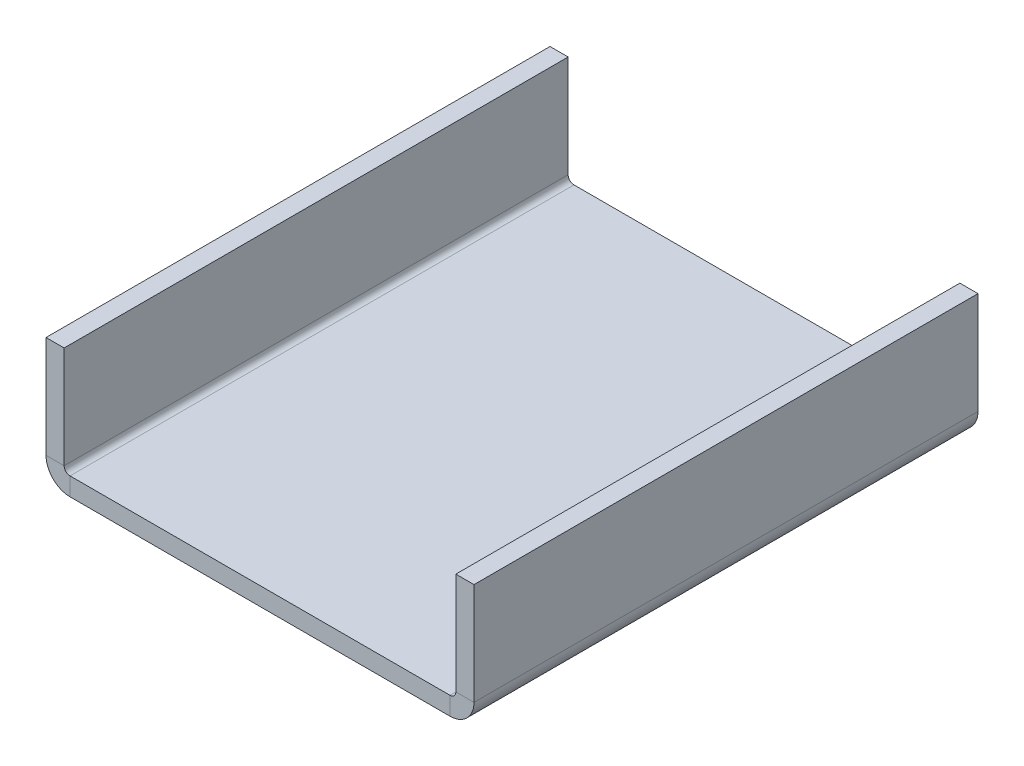
ISO-10303-21;
HEADER;
FILE_DESCRIPTION(('STEP AP214'),'2;1');
FILE_NAME('part.step','',(''),(''),'','','');
FILE_SCHEMA(('AUTOMOTIVE_DESIGN { 1 0 10303 214 1 1 1 1 }'));
ENDSEC;
DATA;
#1=APPLICATION_CONTEXT('core data for automotive mechanical design processes');
#2=APPLICATION_PROTOCOL_DEFINITION('international standard','automotive_design',2000,#1);
#3=PRODUCT_CONTEXT('',#1,'mechanical');
#4=PRODUCT('Part','Part','',(#3));
#5=PRODUCT_RELATED_PRODUCT_CATEGORY('part','',(#4));
#6=PRODUCT_DEFINITION_FORMATION('','',#4);
#7=PRODUCT_DEFINITION_CONTEXT('part definition',#1,'design');
#8=PRODUCT_DEFINITION('design','',#6,#7);
#9=PRODUCT_DEFINITION_SHAPE('','',#8);
#10=(LENGTH_UNIT() NAMED_UNIT(*) SI_UNIT(.MILLI.,.METRE.));
#11=(NAMED_UNIT(*) PLANE_ANGLE_UNIT() SI_UNIT($,.RADIAN.));
#12=(NAMED_UNIT(*) SI_UNIT($,.STERADIAN.) SOLID_ANGLE_UNIT());
#13=UNCERTAINTY_MEASURE_WITH_UNIT(LENGTH_MEASURE(1.E-05),#10,'distance_accuracy_value','');
#14=(GEOMETRIC_REPRESENTATION_CONTEXT(3) GLOBAL_UNCERTAINTY_ASSIGNED_CONTEXT((#13)) GLOBAL_UNIT_ASSIGNED_CONTEXT((#10,
#11,#12)) REPRESENTATION_CONTEXT('',''));
#15=CARTESIAN_POINT('',(0.,0.,0.));
#16=DIRECTION('',(0.,0.,1.));
#17=DIRECTION('',(1.,0.,0.));
#18=AXIS2_PLACEMENT_3D('',#15,#16,#17);
#19=CARTESIAN_POINT('',(0.,-2.286,0.));
#20=DIRECTION('',(0.,-1.,0.));
#21=DIRECTION('',(0.,0.,-1.));
#22=AXIS2_PLACEMENT_3D('',#19,#20,#21);
#23=PLANE('',#22);
#24=DIRECTION('',(-1.,0.,0.));
#25=VECTOR('',#24,1.);
#26=CARTESIAN_POINT('',(-26.9621,-2.286,-31.75));
#27=LINE('',#26,#25);
#28=CARTESIAN_POINT('',(23.9395,-2.286,-31.75));
#29=VERTEX_POINT('',#28);
#30=CARTESIAN_POINT('',(-23.9395,-2.286,-31.75));
#31=VERTEX_POINT('',#30);
#32=EDGE_CURVE('E90',#29,#31,#27,.T.);
#33=ORIENTED_EDGE('',*,*,#32,.F.);
#34=DIRECTION('',(0.,0.,-1.));
#35=VECTOR('',#34,1.);
#36=CARTESIAN_POINT('',(23.9395,-2.286,-31.75));
#37=LINE('',#36,#35);
#38=CARTESIAN_POINT('',(23.9395,-2.286,31.75));
#39=VERTEX_POINT('',#38);
#40=EDGE_CURVE('E213',#29,#39,#37,.F.);
#41=ORIENTED_EDGE('',*,*,#40,.T.);
#42=DIRECTION('',(1.,0.,0.));
#43=VECTOR('',#42,1.);
#44=CARTESIAN_POINT('',(-26.9621,-2.286,31.75));
#45=LINE('',#44,#43);
#46=CARTESIAN_POINT('',(-23.9395,-2.286,31.75));
#47=VERTEX_POINT('',#46);
#48=EDGE_CURVE('E13',#47,#39,#45,.T.);
#49=ORIENTED_EDGE('',*,*,#48,.F.);
#50=DIRECTION('',(0.,0.,1.));
#51=VECTOR('',#50,1.);
#52=CARTESIAN_POINT('',(-23.9395,-2.286,31.75));
#53=LINE('',#52,#51);
#54=EDGE_CURVE('E264',#47,#31,#53,.F.);
#55=ORIENTED_EDGE('',*,*,#54,.T.);
#56=EDGE_LOOP('',(#33,#41,#49,#55));
#57=FACE_BOUND('',#56,.T.);
#58=ADVANCED_FACE('F81',(#57),#23,.T.);
#59=CARTESIAN_POINT('',(0.,0.,0.));
#60=DIRECTION('',(0.,-1.,0.));
#61=DIRECTION('',(0.,0.,-1.));
#62=AXIS2_PLACEMENT_3D('',#59,#60,#61);
#63=PLANE('',#62);
#64=DIRECTION('',(0.,0.,-1.));
#65=VECTOR('',#64,1.);
#66=CARTESIAN_POINT('',(23.9395,0.,-31.75));
#67=LINE('',#66,#65);
#68=CARTESIAN_POINT('',(23.9395,0.,-31.75));
#69=VERTEX_POINT('',#68);
#70=CARTESIAN_POINT('',(23.9395,0.,31.75));
#71=VERTEX_POINT('',#70);
#72=EDGE_CURVE('E224',#69,#71,#67,.F.);
#73=ORIENTED_EDGE('',*,*,#72,.F.);
#74=DIRECTION('',(-1.,0.,0.));
#75=VECTOR('',#74,1.);
#76=CARTESIAN_POINT('',(-26.9621,0.,-31.75));
#77=LINE('',#76,#75);
#78=CARTESIAN_POINT('',(-23.9395,0.,-31.75));
#79=VERTEX_POINT('',#78);
#80=EDGE_CURVE('E281',#69,#79,#77,.T.);
#81=ORIENTED_EDGE('',*,*,#80,.T.);
#82=DIRECTION('',(0.,0.,1.));
#83=VECTOR('',#82,1.);
#84=CARTESIAN_POINT('',(-23.9395,0.,31.75));
#85=LINE('',#84,#83);
#86=CARTESIAN_POINT('',(-23.9395,0.,31.75));
#87=VERTEX_POINT('',#86);
#88=EDGE_CURVE('E275',#87,#79,#85,.F.);
#89=ORIENTED_EDGE('',*,*,#88,.F.);
#90=DIRECTION('',(1.,0.,0.));
#91=VECTOR('',#90,1.);
#92=CARTESIAN_POINT('',(-26.9621,0.,31.75));
#93=LINE('',#92,#91);
#94=EDGE_CURVE('E85',#87,#71,#93,.T.);
#95=ORIENTED_EDGE('',*,*,#94,.T.);
#96=EDGE_LOOP('',(#73,#81,#89,#95));
#97=FACE_BOUND('',#96,.T.);
#98=ADVANCED_FACE('F293',(#97),#63,.F.);
#99=CARTESIAN_POINT('',(-26.9621,-2.286,-31.75));
#100=DIRECTION('',(0.,0.,-1.));
#101=DIRECTION('',(-1.,0.,0.));
#102=AXIS2_PLACEMENT_3D('',#99,#100,#101);
#103=PLANE('',#102);
#104=ORIENTED_EDGE('',*,*,#80,.F.);
#105=DIRECTION('',(0.,-1.,0.));
#106=VECTOR('',#105,1.);
#107=CARTESIAN_POINT('',(23.9395,0.,-31.75));
#108=LINE('',#107,#106);
#109=EDGE_CURVE('E218',#69,#29,#108,.T.);
#110=ORIENTED_EDGE('',*,*,#109,.T.);
#111=ORIENTED_EDGE('',*,*,#32,.T.);
#112=DIRECTION('',(0.,-1.,0.));
#113=VECTOR('',#112,1.);
#114=CARTESIAN_POINT('',(-23.9395,0.,-31.75));
#115=LINE('',#114,#113);
#116=EDGE_CURVE('E279',#79,#31,#115,.T.);
#117=ORIENTED_EDGE('',*,*,#116,.F.);
#118=EDGE_LOOP('',(#104,#110,#111,#117));
#119=FACE_BOUND('',#118,.T.);
#120=ADVANCED_FACE('F83',(#119),#103,.T.);
#121=CARTESIAN_POINT('',(-26.9621,-2.286,31.75));
#122=DIRECTION('',(0.,0.,1.));
#123=DIRECTION('',(1.,0.,0.));
#124=AXIS2_PLACEMENT_3D('',#121,#122,#123);
#125=PLANE('',#124);
#126=DIRECTION('',(0.,-1.,0.));
#127=VECTOR('',#126,1.);
#128=CARTESIAN_POINT('',(23.9395,0.,31.75));
#129=LINE('',#128,#127);
#130=EDGE_CURVE('E229',#71,#39,#129,.T.);
#131=ORIENTED_EDGE('',*,*,#130,.F.);
#132=ORIENTED_EDGE('',*,*,#94,.F.);
#133=DIRECTION('',(0.,-1.,0.));
#134=VECTOR('',#133,1.);
#135=CARTESIAN_POINT('',(-23.9395,0.,31.75));
#136=LINE('',#135,#134);
#137=EDGE_CURVE('E269',#87,#47,#136,.T.);
#138=ORIENTED_EDGE('',*,*,#137,.T.);
#139=ORIENTED_EDGE('',*,*,#48,.T.);
#140=EDGE_LOOP('',(#131,#132,#138,#139));
#141=FACE_BOUND('',#140,.T.);
#142=ADVANCED_FACE('F296',(#141),#125,.T.);
#143=CARTESIAN_POINT('',(-23.9395,0.7366,-31.75));
#144=DIRECTION('',(0.,0.,-1.));
#145=DIRECTION('',(0.,1.,0.));
#146=AXIS2_PLACEMENT_3D('',#143,#144,#145);
#147=PLANE('',#146);
#148=DIRECTION('',(1.,0.,0.));
#149=VECTOR('',#148,1.);
#150=CARTESIAN_POINT('',(-26.9621,0.736599999999989,-31.75));
#151=LINE('',#150,#149);
#152=CARTESIAN_POINT('',(-24.6761,0.736599999999998,-31.75));
#153=VERTEX_POINT('',#152);
#154=CARTESIAN_POINT('',(-26.9621,0.736599999999989,-31.75));
#155=VERTEX_POINT('',#154);
#156=EDGE_CURVE('E231',#153,#155,#151,.F.);
#157=ORIENTED_EDGE('',*,*,#156,.F.);
#158=CARTESIAN_POINT('',(-23.9395,0.7366,-31.75));
#159=DIRECTION('',(0.,0.,1.));
#160=DIRECTION('',(0.,-1.,0.));
#161=AXIS2_PLACEMENT_3D('',#158,#159,#160);
#162=CIRCLE('',#161,0.7366);
#163=EDGE_CURVE('E272',#79,#153,#162,.F.);
#164=ORIENTED_EDGE('',*,*,#163,.F.);
#165=ORIENTED_EDGE('',*,*,#116,.T.);
#166=CARTESIAN_POINT('',(-23.9395,0.7366,-31.75));
#167=DIRECTION('',(0.,0.,1.));
#168=DIRECTION('',(0.,-1.,0.));
#169=AXIS2_PLACEMENT_3D('',#166,#167,#168);
#170=CIRCLE('',#169,3.0226);
#171=EDGE_CURVE('E98',#31,#155,#170,.F.);
#172=ORIENTED_EDGE('',*,*,#171,.T.);
#173=EDGE_LOOP('',(#157,#164,#165,#172));
#174=FACE_BOUND('',#173,.T.);
#175=ADVANCED_FACE('F311',(#174),#147,.T.);
#176=CARTESIAN_POINT('',(-23.9395,0.736599999999996,31.75));
#177=DIRECTION('',(0.,0.,-1.));
#178=DIRECTION('',(0.,1.,0.));
#179=AXIS2_PLACEMENT_3D('',#176,#177,#178);
#180=PLANE('',#179);
#181=CARTESIAN_POINT('',(-23.9395,0.736599999999996,31.75));
#182=DIRECTION('',(0.,0.,1.));
#183=DIRECTION('',(0.,-1.,0.));
#184=AXIS2_PLACEMENT_3D('',#181,#182,#183);
#185=CIRCLE('',#184,0.7366);
#186=CARTESIAN_POINT('',(-24.6761,0.736599999999993,31.75));
#187=VERTEX_POINT('',#186);
#188=EDGE_CURVE('E237',#187,#87,#185,.T.);
#189=ORIENTED_EDGE('',*,*,#188,.F.);
#190=DIRECTION('',(1.,0.,0.));
#191=VECTOR('',#190,1.);
#192=CARTESIAN_POINT('',(-24.6761,0.736599999999993,31.75));
#193=LINE('',#192,#191);
#194=CARTESIAN_POINT('',(-26.9621,0.736599999999985,31.75));
#195=VERTEX_POINT('',#194);
#196=EDGE_CURVE('E257',#187,#195,#193,.F.);
#197=ORIENTED_EDGE('',*,*,#196,.T.);
#198=CARTESIAN_POINT('',(-23.9395,0.736599999999996,31.75));
#199=DIRECTION('',(0.,0.,1.));
#200=DIRECTION('',(0.,-1.,0.));
#201=AXIS2_PLACEMENT_3D('',#198,#199,#200);
#202=CIRCLE('',#201,3.0226);
#203=EDGE_CURVE('E267',#195,#47,#202,.T.);
#204=ORIENTED_EDGE('',*,*,#203,.T.);
#205=ORIENTED_EDGE('',*,*,#137,.F.);
#206=EDGE_LOOP('',(#189,#197,#204,#205));
#207=FACE_BOUND('',#206,.T.);
#208=ADVANCED_FACE('F335',(#207),#180,.F.);
#209=CARTESIAN_POINT('',(-23.9395,0.736599999999996,31.75));
#210=DIRECTION('',(0.,0.,1.));
#211=DIRECTION('',(-1.,0.,0.));
#212=AXIS2_PLACEMENT_3D('',#209,#210,#211);
#213=CYLINDRICAL_SURFACE('',#212,3.0226);
#214=ORIENTED_EDGE('',*,*,#54,.F.);
#215=ORIENTED_EDGE('',*,*,#203,.F.);
#216=DIRECTION('',(0.,0.,1.));
#217=VECTOR('',#216,1.);
#218=CARTESIAN_POINT('',(-26.9621,0.736599999999989,-31.75));
#219=LINE('',#218,#217);
#220=EDGE_CURVE('E255',#195,#155,#219,.F.);
#221=ORIENTED_EDGE('',*,*,#220,.T.);
#222=ORIENTED_EDGE('',*,*,#171,.F.);
#223=EDGE_LOOP('',(#214,#215,#221,#222));
#224=FACE_BOUND('',#223,.T.);
#225=ADVANCED_FACE('F338',(#224),#213,.T.);
#226=CARTESIAN_POINT('',(-23.9395,0.736599999999996,31.75));
#227=DIRECTION('',(0.,0.,1.));
#228=DIRECTION('',(-1.,0.,0.));
#229=AXIS2_PLACEMENT_3D('',#226,#227,#228);
#230=CYLINDRICAL_SURFACE('',#229,0.7366);
#231=ORIENTED_EDGE('',*,*,#88,.T.);
#232=ORIENTED_EDGE('',*,*,#163,.T.);
#233=DIRECTION('',(0.,0.,1.));
#234=VECTOR('',#233,1.);
#235=CARTESIAN_POINT('',(-24.6761,0.736599999999997,-31.75));
#236=LINE('',#235,#234);
#237=EDGE_CURVE('E260',#153,#187,#236,.T.);
#238=ORIENTED_EDGE('',*,*,#237,.T.);
#239=ORIENTED_EDGE('',*,*,#188,.T.);
#240=EDGE_LOOP('',(#231,#232,#238,#239));
#241=FACE_BOUND('',#240,.T.);
#242=ADVANCED_FACE('F314',(#241),#230,.F.);
#243=CARTESIAN_POINT('',(-26.9621,0.,-31.75));
#244=DIRECTION('',(0.,0.,1.));
#245=DIRECTION('',(1.,0.,0.));
#246=AXIS2_PLACEMENT_3D('',#243,#244,#245);
#247=PLANE('',#246);
#248=ORIENTED_EDGE('',*,*,#156,.T.);
#249=DIRECTION('',(0.,-1.,0.));
#250=VECTOR('',#249,1.);
#251=CARTESIAN_POINT('',(-26.9621,-1.04354332234021E-13,-31.75));
#252=LINE('',#251,#250);
#253=CARTESIAN_POINT('',(-26.9621000000001,13.589,-31.75));
#254=VERTEX_POINT('',#253);
#255=EDGE_CURVE('E245',#254,#155,#252,.T.);
#256=ORIENTED_EDGE('',*,*,#255,.F.);
#257=DIRECTION('',(1.,0.,0.));
#258=VECTOR('',#257,1.);
#259=CARTESIAN_POINT('',(-26.9621000000001,13.589,-31.75));
#260=LINE('',#259,#258);
#261=CARTESIAN_POINT('',(-24.6761000000001,13.589,-31.75));
#262=VERTEX_POINT('',#261);
#263=EDGE_CURVE('E238',#254,#262,#260,.T.);
#264=ORIENTED_EDGE('',*,*,#263,.T.);
#265=DIRECTION('',(0.,1.,0.));
#266=VECTOR('',#265,1.);
#267=CARTESIAN_POINT('',(-24.6761,0.,-31.75));
#268=LINE('',#267,#266);
#269=EDGE_CURVE('E252',#262,#153,#268,.F.);
#270=ORIENTED_EDGE('',*,*,#269,.T.);
#271=EDGE_LOOP('',(#248,#256,#264,#270));
#272=FACE_BOUND('',#271,.T.);
#273=ADVANCED_FACE('F322',(#272),#247,.F.);
#274=CARTESIAN_POINT('',(-26.9621000000001,13.589,31.75));
#275=DIRECTION('',(0.,0.,-1.));
#276=DIRECTION('',(-1.,0.,0.));
#277=AXIS2_PLACEMENT_3D('',#274,#275,#276);
#278=PLANE('',#277);
#279=ORIENTED_EDGE('',*,*,#196,.F.);
#280=DIRECTION('',(0.,-1.,0.));
#281=VECTOR('',#280,1.);
#282=CARTESIAN_POINT('',(-24.6761000000001,13.589,31.75));
#283=LINE('',#282,#281);
#284=CARTESIAN_POINT('',(-24.6761000000001,13.589,31.75));
#285=VERTEX_POINT('',#284);
#286=EDGE_CURVE('E250',#187,#285,#283,.F.);
#287=ORIENTED_EDGE('',*,*,#286,.T.);
#288=DIRECTION('',(1.,0.,0.));
#289=VECTOR('',#288,1.);
#290=CARTESIAN_POINT('',(-26.9621000000001,13.589,31.75));
#291=LINE('',#290,#289);
#292=CARTESIAN_POINT('',(-26.9621000000001,13.589,31.75));
#293=VERTEX_POINT('',#292);
#294=EDGE_CURVE('E234',#293,#285,#291,.T.);
#295=ORIENTED_EDGE('',*,*,#294,.F.);
#296=DIRECTION('',(0.,1.,0.));
#297=VECTOR('',#296,1.);
#298=CARTESIAN_POINT('',(-26.9621,-1.04354332234021E-13,31.75));
#299=LINE('',#298,#297);
#300=EDGE_CURVE('E243',#195,#293,#299,.T.);
#301=ORIENTED_EDGE('',*,*,#300,.F.);
#302=EDGE_LOOP('',(#279,#287,#295,#301));
#303=FACE_BOUND('',#302,.T.);
#304=ADVANCED_FACE('F332',(#303),#278,.F.);
#305=CARTESIAN_POINT('',(-26.9621,-1.04354332234021E-13,0.));
#306=DIRECTION('',(1.,0.,0.));
#307=DIRECTION('',(0.,1.,0.));
#308=AXIS2_PLACEMENT_3D('',#305,#306,#307);
#309=PLANE('',#308);
#310=ORIENTED_EDGE('',*,*,#220,.F.);
#311=ORIENTED_EDGE('',*,*,#300,.T.);
#312=DIRECTION('',(0.,0.,-1.));
#313=VECTOR('',#312,1.);
#314=CARTESIAN_POINT('',(-26.9621000000001,13.589,0.));
#315=LINE('',#314,#313);
#316=EDGE_CURVE('E241',#293,#254,#315,.T.);
#317=ORIENTED_EDGE('',*,*,#316,.T.);
#318=ORIENTED_EDGE('',*,*,#255,.T.);
#319=EDGE_LOOP('',(#310,#311,#317,#318));
#320=FACE_BOUND('',#319,.T.);
#321=ADVANCED_FACE('F337',(#320),#309,.F.);
#322=CARTESIAN_POINT('',(-24.6761,0.,0.));
#323=DIRECTION('',(1.,0.,0.));
#324=DIRECTION('',(0.,1.,0.));
#325=AXIS2_PLACEMENT_3D('',#322,#323,#324);
#326=PLANE('',#325);
#327=ORIENTED_EDGE('',*,*,#286,.F.);
#328=ORIENTED_EDGE('',*,*,#237,.F.);
#329=ORIENTED_EDGE('',*,*,#269,.F.);
#330=DIRECTION('',(0.,0.,1.));
#331=VECTOR('',#330,1.);
#332=CARTESIAN_POINT('',(-24.6761000000001,13.589,-31.75));
#333=LINE('',#332,#331);
#334=EDGE_CURVE('E248',#285,#262,#333,.F.);
#335=ORIENTED_EDGE('',*,*,#334,.F.);
#336=EDGE_LOOP('',(#327,#328,#329,#335));
#337=FACE_BOUND('',#336,.T.);
#338=ADVANCED_FACE('F319',(#337),#326,.T.);
#339=CARTESIAN_POINT('',(-26.9621000000001,13.589,-31.75));
#340=DIRECTION('',(0.,-1.,0.));
#341=DIRECTION('',(1.,0.,0.));
#342=AXIS2_PLACEMENT_3D('',#339,#340,#341);
#343=PLANE('',#342);
#344=ORIENTED_EDGE('',*,*,#334,.T.);
#345=ORIENTED_EDGE('',*,*,#263,.F.);
#346=ORIENTED_EDGE('',*,*,#316,.F.);
#347=ORIENTED_EDGE('',*,*,#294,.T.);
#348=EDGE_LOOP('',(#344,#345,#346,#347));
#349=FACE_BOUND('',#348,.T.);
#350=ADVANCED_FACE('F327',(#349),#343,.F.);
#351=CARTESIAN_POINT('',(23.9395,0.736599999999999,31.75));
#352=DIRECTION('',(0.,0.,1.));
#353=DIRECTION('',(0.,-1.,0.));
#354=AXIS2_PLACEMENT_3D('',#351,#352,#353);
#355=PLANE('',#354);
#356=DIRECTION('',(-1.,0.,0.));
#357=VECTOR('',#356,1.);
#358=CARTESIAN_POINT('',(26.9621,0.736599999999989,31.75));
#359=LINE('',#358,#357);
#360=CARTESIAN_POINT('',(24.6761,0.736599999999996,31.75));
#361=VERTEX_POINT('',#360);
#362=CARTESIAN_POINT('',(26.9621,0.736599999999988,31.75));
#363=VERTEX_POINT('',#362);
#364=EDGE_CURVE('E196',#361,#363,#359,.F.);
#365=ORIENTED_EDGE('',*,*,#364,.F.);
#366=CARTESIAN_POINT('',(23.9395,0.736599999999999,31.75));
#367=DIRECTION('',(0.,0.,-1.));
#368=DIRECTION('',(0.,1.,0.));
#369=AXIS2_PLACEMENT_3D('',#366,#367,#368);
#370=CIRCLE('',#369,0.7366);
#371=EDGE_CURVE('E221',#71,#361,#370,.F.);
#372=ORIENTED_EDGE('',*,*,#371,.F.);
#373=ORIENTED_EDGE('',*,*,#130,.T.);
#374=CARTESIAN_POINT('',(23.9395,0.736599999999999,31.75));
#375=DIRECTION('',(0.,0.,-1.));
#376=DIRECTION('',(0.,1.,0.));
#377=AXIS2_PLACEMENT_3D('',#374,#375,#376);
#378=CIRCLE('',#377,3.0226);
#379=EDGE_CURVE('E106',#39,#363,#378,.F.);
#380=ORIENTED_EDGE('',*,*,#379,.T.);
#381=EDGE_LOOP('',(#365,#372,#373,#380));
#382=FACE_BOUND('',#381,.T.);
#383=ADVANCED_FACE('F300',(#382),#355,.T.);
#384=CARTESIAN_POINT('',(23.9395,0.736600000000004,-31.75));
#385=DIRECTION('',(0.,0.,1.));
#386=DIRECTION('',(0.,-1.,0.));
#387=AXIS2_PLACEMENT_3D('',#384,#385,#386);
#388=PLANE('',#387);
#389=CARTESIAN_POINT('',(23.9395,0.736600000000004,-31.75));
#390=DIRECTION('',(0.,0.,-1.));
#391=DIRECTION('',(0.,1.,0.));
#392=AXIS2_PLACEMENT_3D('',#389,#390,#391);
#393=CIRCLE('',#392,0.7366);
#394=CARTESIAN_POINT('',(24.6761,0.736600000000001,-31.75));
#395=VERTEX_POINT('',#394);
#396=EDGE_CURVE('E226',#395,#69,#393,.T.);
#397=ORIENTED_EDGE('',*,*,#396,.F.);
#398=DIRECTION('',(-1.,0.,0.));
#399=VECTOR('',#398,1.);
#400=CARTESIAN_POINT('',(24.6761,0.7366,-31.75));
#401=LINE('',#400,#399);
#402=CARTESIAN_POINT('',(26.9621,0.736599999999992,-31.75));
#403=VERTEX_POINT('',#402);
#404=EDGE_CURVE('E207',#395,#403,#401,.F.);
#405=ORIENTED_EDGE('',*,*,#404,.T.);
#406=CARTESIAN_POINT('',(23.9395,0.736600000000004,-31.75));
#407=DIRECTION('',(0.,0.,-1.));
#408=DIRECTION('',(0.,1.,0.));
#409=AXIS2_PLACEMENT_3D('',#406,#407,#408);
#410=CIRCLE('',#409,3.0226);
#411=EDGE_CURVE('E216',#403,#29,#410,.T.);
#412=ORIENTED_EDGE('',*,*,#411,.T.);
#413=ORIENTED_EDGE('',*,*,#109,.F.);
#414=EDGE_LOOP('',(#397,#405,#412,#413));
#415=FACE_BOUND('',#414,.T.);
#416=ADVANCED_FACE('F306',(#415),#388,.F.);
#417=CARTESIAN_POINT('',(23.9395,0.736600000000004,-31.75));
#418=DIRECTION('',(0.,0.,-1.));
#419=DIRECTION('',(1.,0.,0.));
#420=AXIS2_PLACEMENT_3D('',#417,#418,#419);
#421=CYLINDRICAL_SURFACE('',#420,3.0226);
#422=ORIENTED_EDGE('',*,*,#40,.F.);
#423=ORIENTED_EDGE('',*,*,#411,.F.);
#424=DIRECTION('',(0.,0.,-1.));
#425=VECTOR('',#424,1.);
#426=CARTESIAN_POINT('',(26.9621,0.736599999999989,31.75));
#427=LINE('',#426,#425);
#428=EDGE_CURVE('E205',#403,#363,#427,.F.);
#429=ORIENTED_EDGE('',*,*,#428,.T.);
#430=ORIENTED_EDGE('',*,*,#379,.F.);
#431=EDGE_LOOP('',(#422,#423,#429,#430));
#432=FACE_BOUND('',#431,.T.);
#433=ADVANCED_FACE('F303',(#432),#421,.T.);
#434=CARTESIAN_POINT('',(23.9395,0.736600000000004,-31.75));
#435=DIRECTION('',(0.,0.,-1.));
#436=DIRECTION('',(1.,0.,0.));
#437=AXIS2_PLACEMENT_3D('',#434,#435,#436);
#438=CYLINDRICAL_SURFACE('',#437,0.7366);
#439=ORIENTED_EDGE('',*,*,#72,.T.);
#440=ORIENTED_EDGE('',*,*,#371,.T.);
#441=DIRECTION('',(0.,0.,-1.));
#442=VECTOR('',#441,1.);
#443=CARTESIAN_POINT('',(24.6761,0.736599999999997,31.75));
#444=LINE('',#443,#442);
#445=EDGE_CURVE('E210',#361,#395,#444,.T.);
#446=ORIENTED_EDGE('',*,*,#445,.T.);
#447=ORIENTED_EDGE('',*,*,#396,.T.);
#448=EDGE_LOOP('',(#439,#440,#446,#447));
#449=FACE_BOUND('',#448,.T.);
#450=ADVANCED_FACE('F486',(#449),#438,.F.);
#451=CARTESIAN_POINT('',(26.9621,0.,31.75));
#452=DIRECTION('',(0.,0.,-1.));
#453=DIRECTION('',(-1.,0.,0.));
#454=AXIS2_PLACEMENT_3D('',#451,#452,#453);
#455=PLANE('',#454);
#456=ORIENTED_EDGE('',*,*,#364,.T.);
#457=DIRECTION('',(0.,-1.,0.));
#458=VECTOR('',#457,1.);
#459=CARTESIAN_POINT('',(26.9621,-1.04354332234021E-13,31.75));
#460=LINE('',#459,#458);
#461=CARTESIAN_POINT('',(26.9621000000001,13.589,31.75));
#462=VERTEX_POINT('',#461);
#463=EDGE_CURVE('E177',#462,#363,#460,.T.);
#464=ORIENTED_EDGE('',*,*,#463,.F.);
#465=DIRECTION('',(-1.,0.,0.));
#466=VECTOR('',#465,1.);
#467=CARTESIAN_POINT('',(26.9621000000001,13.589,31.75));
#468=LINE('',#467,#466);
#469=CARTESIAN_POINT('',(24.6761000000001,13.589,31.75));
#470=VERTEX_POINT('',#469);
#471=EDGE_CURVE('E183',#462,#470,#468,.T.);
#472=ORIENTED_EDGE('',*,*,#471,.T.);
#473=DIRECTION('',(0.,1.,0.));
#474=VECTOR('',#473,1.);
#475=CARTESIAN_POINT('',(24.6761,0.,31.75));
#476=LINE('',#475,#474);
#477=EDGE_CURVE('E203',#470,#361,#476,.F.);
#478=ORIENTED_EDGE('',*,*,#477,.T.);
#479=EDGE_LOOP('',(#456,#464,#472,#478));
#480=FACE_BOUND('',#479,.T.);
#481=ADVANCED_FACE('F195',(#480),#455,.F.);
#482=CARTESIAN_POINT('',(26.9621000000001,13.589,-31.75));
#483=DIRECTION('',(0.,0.,1.));
#484=DIRECTION('',(1.,0.,0.));
#485=AXIS2_PLACEMENT_3D('',#482,#483,#484);
#486=PLANE('',#485);
#487=ORIENTED_EDGE('',*,*,#404,.F.);
#488=DIRECTION('',(0.,-1.,0.));
#489=VECTOR('',#488,1.);
#490=CARTESIAN_POINT('',(24.6761000000001,13.589,-31.75));
#491=LINE('',#490,#489);
#492=CARTESIAN_POINT('',(24.6761000000001,13.589,-31.75));
#493=VERTEX_POINT('',#492);
#494=EDGE_CURVE('E199',#395,#493,#491,.F.);
#495=ORIENTED_EDGE('',*,*,#494,.T.);
#496=DIRECTION('',(-1.,0.,0.));
#497=VECTOR('',#496,1.);
#498=CARTESIAN_POINT('',(26.9621000000001,13.589,-31.75));
#499=LINE('',#498,#497);
#500=CARTESIAN_POINT('',(26.9621000000001,13.589,-31.75));
#501=VERTEX_POINT('',#500);
#502=EDGE_CURVE('E192',#501,#493,#499,.T.);
#503=ORIENTED_EDGE('',*,*,#502,.F.);
#504=DIRECTION('',(0.,1.,0.));
#505=VECTOR('',#504,1.);
#506=CARTESIAN_POINT('',(26.9621,-1.04354332234021E-13,-31.75));
#507=LINE('',#506,#505);
#508=EDGE_CURVE('E179',#403,#501,#507,.T.);
#509=ORIENTED_EDGE('',*,*,#508,.F.);
#510=EDGE_LOOP('',(#487,#495,#503,#509));
#511=FACE_BOUND('',#510,.T.);
#512=ADVANCED_FACE('F508',(#511),#486,.F.);
#513=CARTESIAN_POINT('',(26.9621,-1.04354332234021E-13,0.));
#514=DIRECTION('',(-1.,0.,0.));
#515=DIRECTION('',(0.,-1.,0.));
#516=AXIS2_PLACEMENT_3D('',#513,#514,#515);
#517=PLANE('',#516);
#518=ORIENTED_EDGE('',*,*,#428,.F.);
#519=ORIENTED_EDGE('',*,*,#508,.T.);
#520=DIRECTION('',(0.,0.,1.));
#521=VECTOR('',#520,1.);
#522=CARTESIAN_POINT('',(26.9621000000001,13.589,0.));
#523=LINE('',#522,#521);
#524=EDGE_CURVE('E172',#501,#462,#523,.T.);
#525=ORIENTED_EDGE('',*,*,#524,.T.);
#526=ORIENTED_EDGE('',*,*,#463,.T.);
#527=EDGE_LOOP('',(#518,#519,#525,#526));
#528=FACE_BOUND('',#527,.T.);
#529=ADVANCED_FACE('F175',(#528),#517,.F.);
#530=CARTESIAN_POINT('',(24.6761,0.,0.));
#531=DIRECTION('',(-1.,0.,0.));
#532=DIRECTION('',(0.,-1.,0.));
#533=AXIS2_PLACEMENT_3D('',#530,#531,#532);
#534=PLANE('',#533);
#535=ORIENTED_EDGE('',*,*,#494,.F.);
#536=ORIENTED_EDGE('',*,*,#445,.F.);
#537=ORIENTED_EDGE('',*,*,#477,.F.);
#538=DIRECTION('',(0.,0.,-1.));
#539=VECTOR('',#538,1.);
#540=CARTESIAN_POINT('',(24.6761000000001,13.589,31.75));
#541=LINE('',#540,#539);
#542=EDGE_CURVE('E188',#493,#470,#541,.F.);
#543=ORIENTED_EDGE('',*,*,#542,.F.);
#544=EDGE_LOOP('',(#535,#536,#537,#543));
#545=FACE_BOUND('',#544,.T.);
#546=ADVANCED_FACE('F530',(#545),#534,.T.);
#547=CARTESIAN_POINT('',(26.9621000000001,13.589,31.75));
#548=DIRECTION('',(0.,-1.,0.));
#549=DIRECTION('',(1.,0.,0.));
#550=AXIS2_PLACEMENT_3D('',#547,#548,#549);
#551=PLANE('',#550);
#552=ORIENTED_EDGE('',*,*,#542,.T.);
#553=ORIENTED_EDGE('',*,*,#471,.F.);
#554=ORIENTED_EDGE('',*,*,#524,.F.);
#555=ORIENTED_EDGE('',*,*,#502,.T.);
#556=EDGE_LOOP('',(#552,#553,#554,#555));
#557=FACE_BOUND('',#556,.T.);
#558=ADVANCED_FACE('F186',(#557),#551,.F.);
#559=CLOSED_SHELL('',(#58,#98,#120,#142,#175,#208,#225,#242,#273,#304,#321,#338,#350,#383,#416,
#433,#450,#481,#512,#529,#546,#558));
#560=MANIFOLD_SOLID_BREP('B2',#559);
#561=ADVANCED_BREP_SHAPE_REPRESENTATION('',(#18,#560),#14);
#562=SHAPE_DEFINITION_REPRESENTATION(#9,#561);
ENDSEC;
END-ISO-10303-21;
